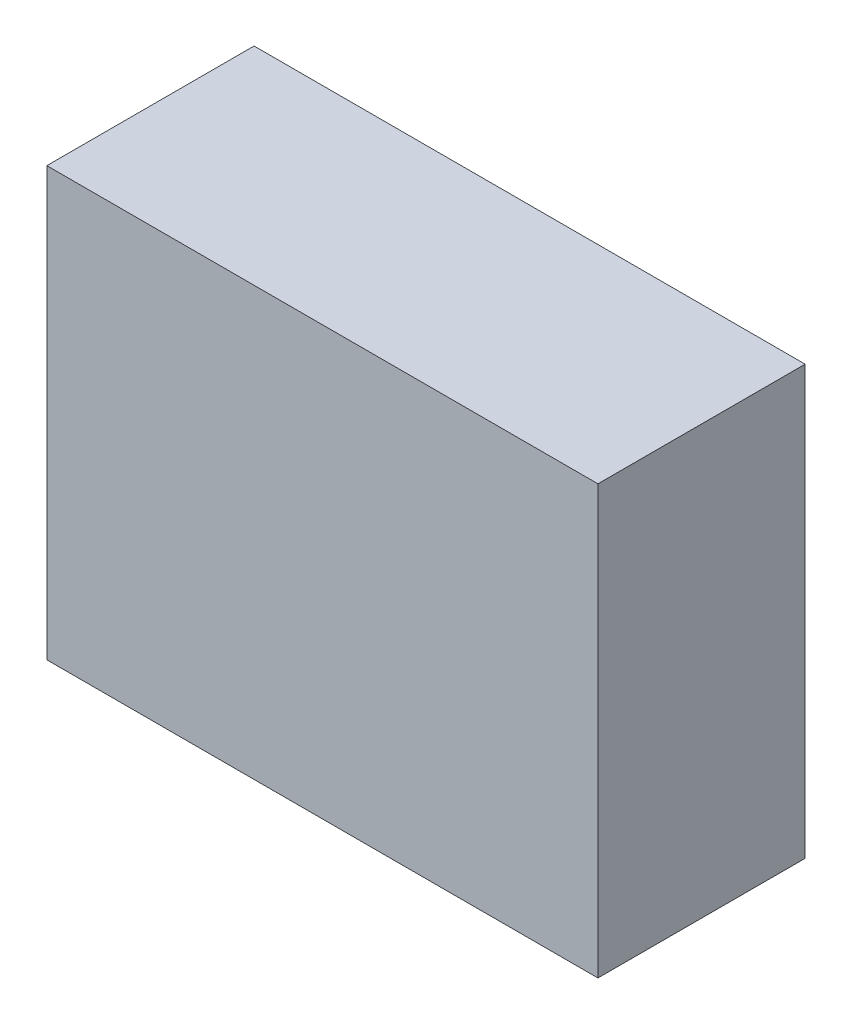
ISO-10303-21;
HEADER;
FILE_DESCRIPTION(('STEP AP214'),'2;1');
FILE_NAME('part.step','',(''),(''),'','','');
FILE_SCHEMA(('AUTOMOTIVE_DESIGN { 1 0 10303 214 1 1 1 1 }'));
ENDSEC;
DATA;
#1=APPLICATION_CONTEXT('core data for automotive mechanical design processes');
#2=APPLICATION_PROTOCOL_DEFINITION('international standard','automotive_design',2000,#1);
#3=PRODUCT_CONTEXT('',#1,'mechanical');
#4=PRODUCT('Part','Part','',(#3));
#5=PRODUCT_RELATED_PRODUCT_CATEGORY('part','',(#4));
#6=PRODUCT_DEFINITION_FORMATION('','',#4);
#7=PRODUCT_DEFINITION_CONTEXT('part definition',#1,'design');
#8=PRODUCT_DEFINITION('design','',#6,#7);
#9=PRODUCT_DEFINITION_SHAPE('','',#8);
#10=(LENGTH_UNIT() NAMED_UNIT(*) SI_UNIT(.MILLI.,.METRE.));
#11=(NAMED_UNIT(*) PLANE_ANGLE_UNIT() SI_UNIT($,.RADIAN.));
#12=(NAMED_UNIT(*) SI_UNIT($,.STERADIAN.) SOLID_ANGLE_UNIT());
#13=UNCERTAINTY_MEASURE_WITH_UNIT(LENGTH_MEASURE(1.E-05),#10,'distance_accuracy_value','');
#14=(GEOMETRIC_REPRESENTATION_CONTEXT(3) GLOBAL_UNCERTAINTY_ASSIGNED_CONTEXT((#13)) GLOBAL_UNIT_ASSIGNED_CONTEXT((#10,
#11,#12)) REPRESENTATION_CONTEXT('',''));
#15=CARTESIAN_POINT('',(0.,0.,0.));
#16=DIRECTION('',(0.,0.,1.));
#17=DIRECTION('',(1.,0.,0.));
#18=AXIS2_PLACEMENT_3D('',#15,#16,#17);
#19=CARTESIAN_POINT('',(111.242204040792,-51.3297437669351,15.));
#20=DIRECTION('',(-1.,0.,0.));
#21=DIRECTION('',(0.,0.,1.));
#22=AXIS2_PLACEMENT_3D('',#19,#20,#21);
#23=PLANE('',#22);
#24=DIRECTION('',(0.,1.,0.));
#25=VECTOR('',#24,1.);
#26=CARTESIAN_POINT('',(111.242204040792,-51.3297437669351,0.));
#27=LINE('',#26,#25);
#28=CARTESIAN_POINT('',(111.242204040792,-51.3297437669351,0.));
#29=VERTEX_POINT('',#28);
#30=CARTESIAN_POINT('',(111.242204040792,-20.3506104333613,0.));
#31=VERTEX_POINT('',#30);
#32=EDGE_CURVE('E104',#29,#31,#27,.T.);
#33=ORIENTED_EDGE('',*,*,#32,.T.);
#34=DIRECTION('',(0.,0.,-1.));
#35=VECTOR('',#34,1.);
#36=CARTESIAN_POINT('',(111.242204040792,-20.3506104333613,15.));
#37=LINE('',#36,#35);
#38=CARTESIAN_POINT('',(111.242204040792,-20.3506104333613,15.));
#39=VERTEX_POINT('',#38);
#40=EDGE_CURVE('E11',#39,#31,#37,.T.);
#41=ORIENTED_EDGE('',*,*,#40,.F.);
#42=DIRECTION('',(0.,1.,0.));
#43=VECTOR('',#42,1.);
#44=CARTESIAN_POINT('',(111.242204040792,-51.3297437669351,15.));
#45=LINE('',#44,#43);
#46=CARTESIAN_POINT('',(111.242204040792,-51.3297437669351,15.));
#47=VERTEX_POINT('',#46);
#48=EDGE_CURVE('E92',#47,#39,#45,.T.);
#49=ORIENTED_EDGE('',*,*,#48,.F.);
#50=DIRECTION('',(0.,0.,-1.));
#51=VECTOR('',#50,1.);
#52=CARTESIAN_POINT('',(111.242204040792,-51.3297437669351,15.));
#53=LINE('',#52,#51);
#54=EDGE_CURVE('E100',#47,#29,#53,.T.);
#55=ORIENTED_EDGE('',*,*,#54,.T.);
#56=EDGE_LOOP('',(#33,#41,#49,#55));
#57=FACE_BOUND('',#56,.T.);
#58=ADVANCED_FACE('F41',(#57),#23,.F.);
#59=CARTESIAN_POINT('',(111.242204040792,-20.3506104333613,15.));
#60=DIRECTION('',(0.,-1.,0.));
#61=DIRECTION('',(0.,0.,-1.));
#62=AXIS2_PLACEMENT_3D('',#59,#60,#61);
#63=PLANE('',#62);
#64=DIRECTION('',(-1.,0.,0.));
#65=VECTOR('',#64,1.);
#66=CARTESIAN_POINT('',(111.242204040792,-20.3506104333613,0.));
#67=LINE('',#66,#65);
#68=CARTESIAN_POINT('',(71.3527419146516,-20.3506104333613,0.));
#69=VERTEX_POINT('',#68);
#70=EDGE_CURVE('E96',#31,#69,#67,.T.);
#71=ORIENTED_EDGE('',*,*,#70,.T.);
#72=DIRECTION('',(0.,0.,-1.));
#73=VECTOR('',#72,1.);
#74=CARTESIAN_POINT('',(71.3527419146516,-20.3506104333613,15.));
#75=LINE('',#74,#73);
#76=CARTESIAN_POINT('',(71.3527419146516,-20.3506104333613,15.));
#77=VERTEX_POINT('',#76);
#78=EDGE_CURVE('E49',#77,#69,#75,.T.);
#79=ORIENTED_EDGE('',*,*,#78,.F.);
#80=DIRECTION('',(-1.,0.,0.));
#81=VECTOR('',#80,1.);
#82=CARTESIAN_POINT('',(111.242204040792,-20.3506104333613,15.));
#83=LINE('',#82,#81);
#84=EDGE_CURVE('E87',#39,#77,#83,.T.);
#85=ORIENTED_EDGE('',*,*,#84,.F.);
#86=ORIENTED_EDGE('',*,*,#40,.T.);
#87=EDGE_LOOP('',(#71,#79,#85,#86));
#88=FACE_BOUND('',#87,.T.);
#89=ADVANCED_FACE('F95',(#88),#63,.F.);
#90=CARTESIAN_POINT('',(71.3527419146516,-51.3297437669351,15.));
#91=DIRECTION('',(1.,0.,0.));
#92=DIRECTION('',(0.,0.,-1.));
#93=AXIS2_PLACEMENT_3D('',#90,#91,#92);
#94=PLANE('',#93);
#95=DIRECTION('',(0.,-1.,0.));
#96=VECTOR('',#95,1.);
#97=CARTESIAN_POINT('',(71.3527419146516,-51.3297437669351,0.));
#98=LINE('',#97,#96);
#99=CARTESIAN_POINT('',(71.3527419146516,-51.3297437669351,0.));
#100=VERTEX_POINT('',#99);
#101=EDGE_CURVE('E74',#69,#100,#98,.T.);
#102=ORIENTED_EDGE('',*,*,#101,.T.);
#103=DIRECTION('',(0.,0.,-1.));
#104=VECTOR('',#103,1.);
#105=CARTESIAN_POINT('',(71.3527419146516,-51.3297437669351,15.));
#106=LINE('',#105,#104);
#107=CARTESIAN_POINT('',(71.3527419146516,-51.3297437669351,15.));
#108=VERTEX_POINT('',#107);
#109=EDGE_CURVE('E97',#108,#100,#106,.T.);
#110=ORIENTED_EDGE('',*,*,#109,.F.);
#111=DIRECTION('',(0.,-1.,0.));
#112=VECTOR('',#111,1.);
#113=CARTESIAN_POINT('',(71.3527419146516,-51.3297437669351,15.));
#114=LINE('',#113,#112);
#115=EDGE_CURVE('E90',#77,#108,#114,.T.);
#116=ORIENTED_EDGE('',*,*,#115,.F.);
#117=ORIENTED_EDGE('',*,*,#78,.T.);
#118=EDGE_LOOP('',(#102,#110,#116,#117));
#119=FACE_BOUND('',#118,.T.);
#120=ADVANCED_FACE('F98',(#119),#94,.F.);
#121=CARTESIAN_POINT('',(111.242204040792,-51.3297437669351,15.));
#122=DIRECTION('',(0.,1.,0.));
#123=DIRECTION('',(0.,0.,1.));
#124=AXIS2_PLACEMENT_3D('',#121,#122,#123);
#125=PLANE('',#124);
#126=DIRECTION('',(1.,0.,0.));
#127=VECTOR('',#126,1.);
#128=CARTESIAN_POINT('',(111.242204040792,-51.3297437669351,0.));
#129=LINE('',#128,#127);
#130=EDGE_CURVE('E80',#100,#29,#129,.T.);
#131=ORIENTED_EDGE('',*,*,#130,.T.);
#132=ORIENTED_EDGE('',*,*,#54,.F.);
#133=DIRECTION('',(1.,0.,0.));
#134=VECTOR('',#133,1.);
#135=CARTESIAN_POINT('',(111.242204040792,-51.3297437669351,15.));
#136=LINE('',#135,#134);
#137=EDGE_CURVE('E57',#108,#47,#136,.T.);
#138=ORIENTED_EDGE('',*,*,#137,.F.);
#139=ORIENTED_EDGE('',*,*,#109,.T.);
#140=EDGE_LOOP('',(#131,#132,#138,#139));
#141=FACE_BOUND('',#140,.T.);
#142=ADVANCED_FACE('F111',(#141),#125,.F.);
#143=CARTESIAN_POINT('',(0.,0.,15.));
#144=DIRECTION('',(0.,0.,1.));
#145=DIRECTION('',(1.,0.,0.));
#146=AXIS2_PLACEMENT_3D('',#143,#144,#145);
#147=PLANE('',#146);
#148=ORIENTED_EDGE('',*,*,#48,.T.);
#149=ORIENTED_EDGE('',*,*,#84,.T.);
#150=ORIENTED_EDGE('',*,*,#115,.T.);
#151=ORIENTED_EDGE('',*,*,#137,.T.);
#152=EDGE_LOOP('',(#148,#149,#150,#151));
#153=FACE_BOUND('',#152,.T.);
#154=ADVANCED_FACE('F88',(#153),#147,.T.);
#155=CARTESIAN_POINT('',(0.,0.,0.));
#156=DIRECTION('',(0.,0.,1.));
#157=DIRECTION('',(1.,0.,0.));
#158=AXIS2_PLACEMENT_3D('',#155,#156,#157);
#159=PLANE('',#158);
#160=ORIENTED_EDGE('',*,*,#32,.F.);
#161=ORIENTED_EDGE('',*,*,#130,.F.);
#162=ORIENTED_EDGE('',*,*,#101,.F.);
#163=ORIENTED_EDGE('',*,*,#70,.F.);
#164=EDGE_LOOP('',(#160,#161,#162,#163));
#165=FACE_BOUND('',#164,.T.);
#166=ADVANCED_FACE('F114',(#165),#159,.F.);
#167=CLOSED_SHELL('',(#58,#89,#120,#142,#154,#166));
#168=MANIFOLD_SOLID_BREP('B2',#167);
#169=ADVANCED_BREP_SHAPE_REPRESENTATION('',(#18,#168),#14);
#170=SHAPE_DEFINITION_REPRESENTATION(#9,#169);
ENDSEC;
END-ISO-10303-21;
